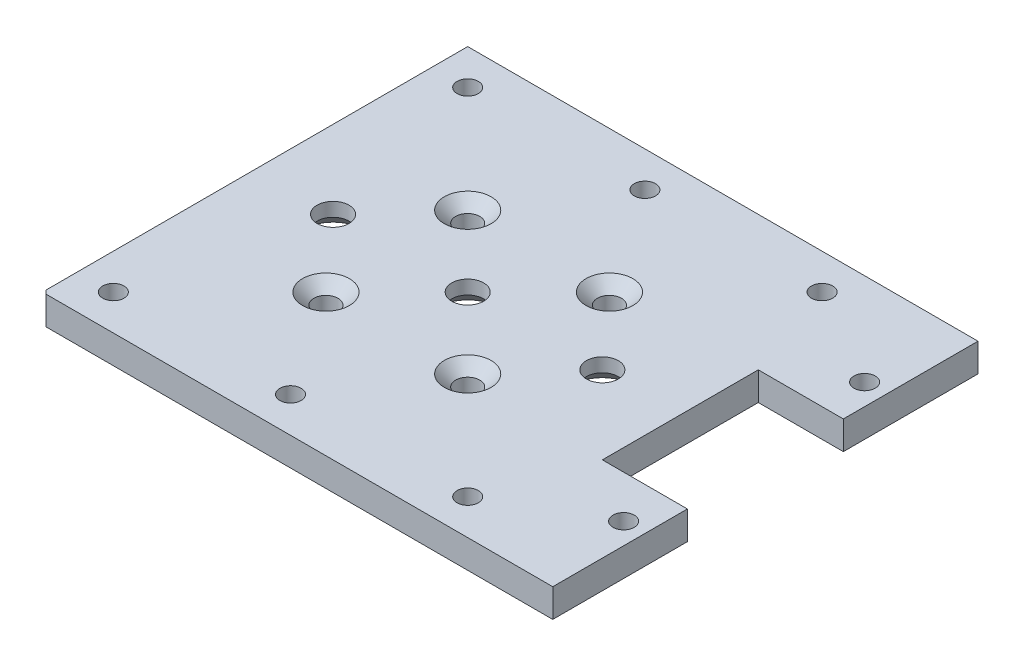
ISO-10303-21;
HEADER;
FILE_DESCRIPTION(('STEP AP214'),'2;1');
FILE_NAME('part.step','',(''),(''),'','','');
FILE_SCHEMA(('AUTOMOTIVE_DESIGN { 1 0 10303 214 1 1 1 1 }'));
ENDSEC;
DATA;
#1=APPLICATION_CONTEXT('core data for automotive mechanical design processes');
#2=APPLICATION_PROTOCOL_DEFINITION('international standard','automotive_design',2000,#1);
#3=PRODUCT_CONTEXT('',#1,'mechanical');
#4=PRODUCT('Part','Part','',(#3));
#5=PRODUCT_RELATED_PRODUCT_CATEGORY('part','',(#4));
#6=PRODUCT_DEFINITION_FORMATION('','',#4);
#7=PRODUCT_DEFINITION_CONTEXT('part definition',#1,'design');
#8=PRODUCT_DEFINITION('design','',#6,#7);
#9=PRODUCT_DEFINITION_SHAPE('','',#8);
#10=(LENGTH_UNIT() NAMED_UNIT(*) SI_UNIT(.MILLI.,.METRE.));
#11=(NAMED_UNIT(*) PLANE_ANGLE_UNIT() SI_UNIT($,.RADIAN.));
#12=(NAMED_UNIT(*) SI_UNIT($,.STERADIAN.) SOLID_ANGLE_UNIT());
#13=UNCERTAINTY_MEASURE_WITH_UNIT(LENGTH_MEASURE(1.E-05),#10,'distance_accuracy_value','');
#14=(GEOMETRIC_REPRESENTATION_CONTEXT(3) GLOBAL_UNCERTAINTY_ASSIGNED_CONTEXT((#13)) GLOBAL_UNIT_ASSIGNED_CONTEXT((#10,
#11,#12)) REPRESENTATION_CONTEXT('',''));
#15=CARTESIAN_POINT('',(0.,0.,0.));
#16=DIRECTION('',(0.,0.,1.));
#17=DIRECTION('',(1.,0.,0.));
#18=AXIS2_PLACEMENT_3D('',#15,#16,#17);
#19=CARTESIAN_POINT('',(30.,4.,30.));
#20=DIRECTION('',(-1.,0.,0.));
#21=DIRECTION('',(0.,0.,1.));
#22=AXIS2_PLACEMENT_3D('',#19,#20,#21);
#23=PLANE('',#22);
#24=DIRECTION('',(0.,1.,0.));
#25=VECTOR('',#24,1.);
#26=CARTESIAN_POINT('',(30.,-22.4722050542442,-11.));
#27=LINE('',#26,#25);
#28=CARTESIAN_POINT('',(30.,0.,-11.));
#29=VERTEX_POINT('',#28);
#30=CARTESIAN_POINT('',(30.,4.,-11.));
#31=VERTEX_POINT('',#30);
#32=EDGE_CURVE('E57',#29,#31,#27,.T.);
#33=ORIENTED_EDGE('',*,*,#32,.T.);
#34=DIRECTION('',(0.,0.,-1.));
#35=VECTOR('',#34,1.);
#36=CARTESIAN_POINT('',(30.,4.,30.));
#37=LINE('',#36,#35);
#38=CARTESIAN_POINT('',(30.,4.,11.));
#39=VERTEX_POINT('',#38);
#40=EDGE_CURVE('E133',#39,#31,#37,.T.);
#41=ORIENTED_EDGE('',*,*,#40,.F.);
#42=DIRECTION('',(0.,1.,0.));
#43=VECTOR('',#42,1.);
#44=CARTESIAN_POINT('',(30.,-22.4722050542442,11.));
#45=LINE('',#44,#43);
#46=CARTESIAN_POINT('',(30.,0.,11.));
#47=VERTEX_POINT('',#46);
#48=EDGE_CURVE('E162',#47,#39,#45,.T.);
#49=ORIENTED_EDGE('',*,*,#48,.F.);
#50=DIRECTION('',(0.,0.,-1.));
#51=VECTOR('',#50,1.);
#52=CARTESIAN_POINT('',(30.,0.,30.));
#53=LINE('',#52,#51);
#54=EDGE_CURVE('E62',#47,#29,#53,.T.);
#55=ORIENTED_EDGE('',*,*,#54,.T.);
#56=EDGE_LOOP('',(#33,#41,#49,#55));
#57=FACE_BOUND('',#56,.T.);
#58=ADVANCED_FACE('F41',(#57),#23,.F.);
#59=CARTESIAN_POINT('',(-30.,4.,-30.));
#60=DIRECTION('',(0.,0.,1.));
#61=DIRECTION('',(1.,0.,0.));
#62=AXIS2_PLACEMENT_3D('',#59,#60,#61);
#63=PLANE('',#62);
#64=DIRECTION('',(-1.,0.,0.));
#65=VECTOR('',#64,1.);
#66=CARTESIAN_POINT('',(-30.,0.,-30.));
#67=LINE('',#66,#65);
#68=CARTESIAN_POINT('',(42.,0.,-30.));
#69=VERTEX_POINT('',#68);
#70=CARTESIAN_POINT('',(-30.,0.,-30.));
#71=VERTEX_POINT('',#70);
#72=EDGE_CURVE('E280',#69,#71,#67,.T.);
#73=ORIENTED_EDGE('',*,*,#72,.T.);
#74=DIRECTION('',(0.,-1.,0.));
#75=VECTOR('',#74,1.);
#76=CARTESIAN_POINT('',(-30.,4.,-30.));
#77=LINE('',#76,#75);
#78=CARTESIAN_POINT('',(-30.,4.,-30.));
#79=VERTEX_POINT('',#78);
#80=EDGE_CURVE('E278',#79,#71,#77,.T.);
#81=ORIENTED_EDGE('',*,*,#80,.F.);
#82=DIRECTION('',(-1.,0.,0.));
#83=VECTOR('',#82,1.);
#84=CARTESIAN_POINT('',(-30.,4.,-30.));
#85=LINE('',#84,#83);
#86=CARTESIAN_POINT('',(42.,4.,-30.));
#87=VERTEX_POINT('',#86);
#88=EDGE_CURVE('E271',#87,#79,#85,.T.);
#89=ORIENTED_EDGE('',*,*,#88,.F.);
#90=DIRECTION('',(0.,1.,0.));
#91=VECTOR('',#90,1.);
#92=CARTESIAN_POINT('',(42.,-22.4722050542442,-30.));
#93=LINE('',#92,#91);
#94=EDGE_CURVE('E120',#69,#87,#93,.T.);
#95=ORIENTED_EDGE('',*,*,#94,.F.);
#96=EDGE_LOOP('',(#73,#81,#89,#95));
#97=FACE_BOUND('',#96,.T.);
#98=ADVANCED_FACE('F319',(#97),#63,.F.);
#99=CARTESIAN_POINT('',(-30.,4.,30.));
#100=DIRECTION('',(1.,0.,0.));
#101=DIRECTION('',(0.,0.,-1.));
#102=AXIS2_PLACEMENT_3D('',#99,#100,#101);
#103=PLANE('',#102);
#104=DIRECTION('',(0.,0.,1.));
#105=VECTOR('',#104,1.);
#106=CARTESIAN_POINT('',(-30.,0.,30.));
#107=LINE('',#106,#105);
#108=CARTESIAN_POINT('',(-30.,0.,29.5));
#109=VERTEX_POINT('',#108);
#110=EDGE_CURVE('E282',#71,#109,#107,.T.);
#111=ORIENTED_EDGE('',*,*,#110,.T.);
#112=DIRECTION('',(0.,1.,0.));
#113=VECTOR('',#112,1.);
#114=CARTESIAN_POINT('',(-30.,4.,29.5));
#115=LINE('',#114,#113);
#116=CARTESIAN_POINT('',(-30.,4.,29.5));
#117=VERTEX_POINT('',#116);
#118=EDGE_CURVE('E50',#109,#117,#115,.T.);
#119=ORIENTED_EDGE('',*,*,#118,.T.);
#120=DIRECTION('',(0.,0.,1.));
#121=VECTOR('',#120,1.);
#122=CARTESIAN_POINT('',(-30.,4.,30.));
#123=LINE('',#122,#121);
#124=EDGE_CURVE('E274',#79,#117,#123,.T.);
#125=ORIENTED_EDGE('',*,*,#124,.F.);
#126=ORIENTED_EDGE('',*,*,#80,.T.);
#127=EDGE_LOOP('',(#111,#119,#125,#126));
#128=FACE_BOUND('',#127,.T.);
#129=ADVANCED_FACE('F295',(#128),#103,.F.);
#130=CARTESIAN_POINT('',(-30.,4.,30.));
#131=DIRECTION('',(0.,0.,-1.));
#132=DIRECTION('',(-1.,0.,0.));
#133=AXIS2_PLACEMENT_3D('',#130,#131,#132);
#134=PLANE('',#133);
#135=DIRECTION('',(1.,0.,0.));
#136=VECTOR('',#135,1.);
#137=CARTESIAN_POINT('',(-30.,4.,30.));
#138=LINE('',#137,#136);
#139=CARTESIAN_POINT('',(-29.5,4.,30.));
#140=VERTEX_POINT('',#139);
#141=CARTESIAN_POINT('',(42.,4.,30.));
#142=VERTEX_POINT('',#141);
#143=EDGE_CURVE('E276',#140,#142,#138,.T.);
#144=ORIENTED_EDGE('',*,*,#143,.F.);
#145=DIRECTION('',(0.,-1.,0.));
#146=VECTOR('',#145,1.);
#147=CARTESIAN_POINT('',(-29.5,4.,30.));
#148=LINE('',#147,#146);
#149=CARTESIAN_POINT('',(-29.5,0.,30.));
#150=VERTEX_POINT('',#149);
#151=EDGE_CURVE('E288',#140,#150,#148,.T.);
#152=ORIENTED_EDGE('',*,*,#151,.T.);
#153=DIRECTION('',(1.,0.,0.));
#154=VECTOR('',#153,1.);
#155=CARTESIAN_POINT('',(-30.,0.,30.));
#156=LINE('',#155,#154);
#157=CARTESIAN_POINT('',(42.,0.,30.));
#158=VERTEX_POINT('',#157);
#159=EDGE_CURVE('E272',#150,#158,#156,.T.);
#160=ORIENTED_EDGE('',*,*,#159,.T.);
#161=DIRECTION('',(0.,1.,0.));
#162=VECTOR('',#161,1.);
#163=CARTESIAN_POINT('',(42.,-22.4722050542442,30.));
#164=LINE('',#163,#162);
#165=EDGE_CURVE('E156',#158,#142,#164,.T.);
#166=ORIENTED_EDGE('',*,*,#165,.T.);
#167=EDGE_LOOP('',(#144,#152,#160,#166));
#168=FACE_BOUND('',#167,.T.);
#169=ADVANCED_FACE('F304',(#168),#134,.F.);
#170=CARTESIAN_POINT('',(0.,4.,0.));
#171=DIRECTION('',(0.,-1.,0.));
#172=DIRECTION('',(0.,0.,-1.));
#173=AXIS2_PLACEMENT_3D('',#170,#171,#172);
#174=PLANE('',#173);
#175=CARTESIAN_POINT('',(25.,4.,-25.));
#176=DIRECTION('',(0.,1.,0.));
#177=DIRECTION('',(0.,0.,1.));
#178=AXIS2_PLACEMENT_3D('',#175,#176,#177);
#179=CIRCLE('',#178,1.50000000000001);
#180=CARTESIAN_POINT('',(25.,4.,-23.5));
#181=VERTEX_POINT('',#180);
#182=EDGE_CURVE('E159',#181,#181,#179,.T.);
#183=ORIENTED_EDGE('',*,*,#182,.F.);
#184=EDGE_LOOP('',(#183));
#185=FACE_BOUND('',#184,.T.);
#186=CARTESIAN_POINT('',(25.,4.,25.));
#187=DIRECTION('',(0.,1.,0.));
#188=DIRECTION('',(0.,0.,1.));
#189=AXIS2_PLACEMENT_3D('',#186,#187,#188);
#190=CIRCLE('',#189,1.50000000000001);
#191=CARTESIAN_POINT('',(25.,4.,26.5));
#192=VERTEX_POINT('',#191);
#193=EDGE_CURVE('E177',#192,#192,#190,.T.);
#194=ORIENTED_EDGE('',*,*,#193,.F.);
#195=EDGE_LOOP('',(#194));
#196=FACE_BOUND('',#195,.T.);
#197=CARTESIAN_POINT('',(0.,4.,25.));
#198=DIRECTION('',(0.,1.,0.));
#199=DIRECTION('',(0.,0.,1.));
#200=AXIS2_PLACEMENT_3D('',#197,#198,#199);
#201=CIRCLE('',#200,1.50000000000001);
#202=CARTESIAN_POINT('',(0.,4.,26.5));
#203=VERTEX_POINT('',#202);
#204=EDGE_CURVE('E183',#203,#203,#201,.T.);
#205=ORIENTED_EDGE('',*,*,#204,.F.);
#206=EDGE_LOOP('',(#205));
#207=FACE_BOUND('',#206,.T.);
#208=CARTESIAN_POINT('',(-25.,4.,25.));
#209=DIRECTION('',(0.,1.,0.));
#210=DIRECTION('',(0.,0.,1.));
#211=AXIS2_PLACEMENT_3D('',#208,#209,#210);
#212=CIRCLE('',#211,1.50000000000001);
#213=CARTESIAN_POINT('',(-25.,4.,26.5));
#214=VERTEX_POINT('',#213);
#215=EDGE_CURVE('E189',#214,#214,#212,.T.);
#216=ORIENTED_EDGE('',*,*,#215,.F.);
#217=EDGE_LOOP('',(#216));
#218=FACE_BOUND('',#217,.T.);
#219=CARTESIAN_POINT('',(-25.,4.,-25.));
#220=DIRECTION('',(0.,1.,0.));
#221=DIRECTION('',(0.,0.,1.));
#222=AXIS2_PLACEMENT_3D('',#219,#220,#221);
#223=CIRCLE('',#222,1.50000000000001);
#224=CARTESIAN_POINT('',(-25.,4.,-23.5));
#225=VERTEX_POINT('',#224);
#226=EDGE_CURVE('E195',#225,#225,#223,.T.);
#227=ORIENTED_EDGE('',*,*,#226,.F.);
#228=EDGE_LOOP('',(#227));
#229=FACE_BOUND('',#228,.T.);
#230=CARTESIAN_POINT('',(0.,4.,-25.));
#231=DIRECTION('',(0.,1.,0.));
#232=DIRECTION('',(0.,0.,1.));
#233=AXIS2_PLACEMENT_3D('',#230,#231,#232);
#234=CIRCLE('',#233,1.50000000000001);
#235=CARTESIAN_POINT('',(0.,4.,-23.5));
#236=VERTEX_POINT('',#235);
#237=EDGE_CURVE('E201',#236,#236,#234,.T.);
#238=ORIENTED_EDGE('',*,*,#237,.F.);
#239=EDGE_LOOP('',(#238));
#240=FACE_BOUND('',#239,.T.);
#241=CARTESIAN_POINT('',(-19.,4.,0.));
#242=DIRECTION('',(0.,-1.,0.));
#243=DIRECTION('',(0.,0.,-1.));
#244=AXIS2_PLACEMENT_3D('',#241,#242,#243);
#245=CIRCLE('',#244,2.25);
#246=CARTESIAN_POINT('',(-19.,4.,-2.25));
#247=VERTEX_POINT('',#246);
#248=EDGE_CURVE('E213',#247,#247,#245,.T.);
#249=ORIENTED_EDGE('',*,*,#248,.T.);
#250=EDGE_LOOP('',(#249));
#251=FACE_BOUND('',#250,.T.);
#252=CARTESIAN_POINT('',(0.,4.,0.));
#253=DIRECTION('',(0.,-1.,0.));
#254=DIRECTION('',(0.,0.,-1.));
#255=AXIS2_PLACEMENT_3D('',#252,#253,#254);
#256=CIRCLE('',#255,2.25);
#257=CARTESIAN_POINT('',(0.,4.,-2.25));
#258=VERTEX_POINT('',#257);
#259=EDGE_CURVE('E222',#258,#258,#256,.T.);
#260=ORIENTED_EDGE('',*,*,#259,.T.);
#261=EDGE_LOOP('',(#260));
#262=FACE_BOUND('',#261,.T.);
#263=CARTESIAN_POINT('',(19.,4.,0.));
#264=DIRECTION('',(0.,-1.,0.));
#265=DIRECTION('',(0.,0.,-1.));
#266=AXIS2_PLACEMENT_3D('',#263,#264,#265);
#267=CIRCLE('',#266,2.25);
#268=CARTESIAN_POINT('',(19.,4.,-2.25));
#269=VERTEX_POINT('',#268);
#270=EDGE_CURVE('E231',#269,#269,#267,.T.);
#271=ORIENTED_EDGE('',*,*,#270,.T.);
#272=EDGE_LOOP('',(#271));
#273=FACE_BOUND('',#272,.T.);
#274=CARTESIAN_POINT('',(-10.,4.,-10.));
#275=DIRECTION('',(0.,1.,0.));
#276=DIRECTION('',(0.,0.,1.));
#277=AXIS2_PLACEMENT_3D('',#274,#275,#276);
#278=CIRCLE('',#277,3.3);
#279=CARTESIAN_POINT('',(-10.,4.,-6.7));
#280=VERTEX_POINT('',#279);
#281=EDGE_CURVE('E234',#280,#280,#278,.T.);
#282=ORIENTED_EDGE('',*,*,#281,.F.);
#283=EDGE_LOOP('',(#282));
#284=FACE_BOUND('',#283,.T.);
#285=CARTESIAN_POINT('',(10.,4.,-10.0000000000006));
#286=DIRECTION('',(0.,1.,0.));
#287=DIRECTION('',(0.,0.,1.));
#288=AXIS2_PLACEMENT_3D('',#285,#286,#287);
#289=CIRCLE('',#288,3.3);
#290=CARTESIAN_POINT('',(10.,4.,-6.70000000000057));
#291=VERTEX_POINT('',#290);
#292=EDGE_CURVE('E243',#291,#291,#289,.T.);
#293=ORIENTED_EDGE('',*,*,#292,.F.);
#294=EDGE_LOOP('',(#293));
#295=FACE_BOUND('',#294,.T.);
#296=CARTESIAN_POINT('',(10.0000000000006,4.,9.99999999999944));
#297=DIRECTION('',(0.,1.,0.));
#298=DIRECTION('',(0.,0.,1.));
#299=AXIS2_PLACEMENT_3D('',#296,#297,#298);
#300=CIRCLE('',#299,3.3);
#301=CARTESIAN_POINT('',(10.0000000000006,4.,13.2999999999994));
#302=VERTEX_POINT('',#301);
#303=EDGE_CURVE('E252',#302,#302,#300,.T.);
#304=ORIENTED_EDGE('',*,*,#303,.F.);
#305=EDGE_LOOP('',(#304));
#306=FACE_BOUND('',#305,.T.);
#307=CARTESIAN_POINT('',(-9.99999999999944,4.,10.));
#308=DIRECTION('',(0.,1.,0.));
#309=DIRECTION('',(0.,0.,1.));
#310=AXIS2_PLACEMENT_3D('',#307,#308,#309);
#311=CIRCLE('',#310,3.3);
#312=CARTESIAN_POINT('',(-9.99999999999944,4.,13.3));
#313=VERTEX_POINT('',#312);
#314=EDGE_CURVE('E261',#313,#313,#311,.T.);
#315=ORIENTED_EDGE('',*,*,#314,.F.);
#316=EDGE_LOOP('',(#315));
#317=FACE_BOUND('',#316,.T.);
#318=ORIENTED_EDGE('',*,*,#124,.T.);
#319=DIRECTION('',(-0.707106781186548,0.,-0.707106781186548));
#320=VECTOR('',#319,1.);
#321=CARTESIAN_POINT('',(-29.5,4.,30.));
#322=LINE('',#321,#320);
#323=EDGE_CURVE('E11',#117,#140,#322,.F.);
#324=ORIENTED_EDGE('',*,*,#323,.T.);
#325=ORIENTED_EDGE('',*,*,#143,.T.);
#326=DIRECTION('',(0.,0.,-1.));
#327=VECTOR('',#326,1.);
#328=CARTESIAN_POINT('',(42.,4.,30.));
#329=LINE('',#328,#327);
#330=CARTESIAN_POINT('',(42.,4.,11.));
#331=VERTEX_POINT('',#330);
#332=EDGE_CURVE('E150',#142,#331,#329,.T.);
#333=ORIENTED_EDGE('',*,*,#332,.T.);
#334=DIRECTION('',(-1.,0.,0.));
#335=VECTOR('',#334,1.);
#336=CARTESIAN_POINT('',(30.,4.,11.));
#337=LINE('',#336,#335);
#338=EDGE_CURVE('E147',#331,#39,#337,.T.);
#339=ORIENTED_EDGE('',*,*,#338,.T.);
#340=ORIENTED_EDGE('',*,*,#40,.T.);
#341=DIRECTION('',(-1.,0.,0.));
#342=VECTOR('',#341,1.);
#343=CARTESIAN_POINT('',(30.,4.,-11.));
#344=LINE('',#343,#342);
#345=CARTESIAN_POINT('',(42.,4.,-11.));
#346=VERTEX_POINT('',#345);
#347=EDGE_CURVE('E114',#346,#31,#344,.T.);
#348=ORIENTED_EDGE('',*,*,#347,.F.);
#349=DIRECTION('',(0.,0.,1.));
#350=VECTOR('',#349,1.);
#351=CARTESIAN_POINT('',(42.,4.,-30.));
#352=LINE('',#351,#350);
#353=EDGE_CURVE('E124',#87,#346,#352,.T.);
#354=ORIENTED_EDGE('',*,*,#353,.F.);
#355=ORIENTED_EDGE('',*,*,#88,.T.);
#356=EDGE_LOOP('',(#318,#324,#325,#333,#339,#340,#348,#354,#355));
#357=FACE_BOUND('',#356,.T.);
#358=CARTESIAN_POINT('',(39.,4.,17.));
#359=DIRECTION('',(0.,1.,0.));
#360=DIRECTION('',(0.,0.,1.));
#361=AXIS2_PLACEMENT_3D('',#358,#359,#360);
#362=CIRCLE('',#361,1.5);
#363=CARTESIAN_POINT('',(39.,4.,18.5));
#364=VERTEX_POINT('',#363);
#365=EDGE_CURVE('E153',#364,#364,#362,.T.);
#366=ORIENTED_EDGE('',*,*,#365,.F.);
#367=EDGE_LOOP('',(#366));
#368=FACE_BOUND('',#367,.T.);
#369=CARTESIAN_POINT('',(39.,4.,-17.));
#370=DIRECTION('',(0.,-1.,0.));
#371=DIRECTION('',(0.,0.,-1.));
#372=AXIS2_PLACEMENT_3D('',#369,#370,#371);
#373=CIRCLE('',#372,1.5);
#374=CARTESIAN_POINT('',(39.,4.,-18.5));
#375=VERTEX_POINT('',#374);
#376=EDGE_CURVE('E134',#375,#375,#373,.T.);
#377=ORIENTED_EDGE('',*,*,#376,.T.);
#378=EDGE_LOOP('',(#377));
#379=FACE_BOUND('',#378,.T.);
#380=ADVANCED_FACE('F130',(#185,#196,#207,#218,#229,#240,#251,#262,#273,#284,#295,#306,#317,
#357,#368,#379),#174,.F.);
#381=CARTESIAN_POINT('',(0.,0.,0.));
#382=DIRECTION('',(0.,-1.,0.));
#383=DIRECTION('',(0.,0.,-1.));
#384=AXIS2_PLACEMENT_3D('',#381,#382,#383);
#385=PLANE('',#384);
#386=CARTESIAN_POINT('',(25.,0.,-25.));
#387=DIRECTION('',(0.,1.,0.));
#388=DIRECTION('',(0.,0.,1.));
#389=AXIS2_PLACEMENT_3D('',#386,#387,#388);
#390=CIRCLE('',#389,1.50000000000001);
#391=CARTESIAN_POINT('',(25.,0.,-23.5));
#392=VERTEX_POINT('',#391);
#393=EDGE_CURVE('E174',#392,#392,#390,.T.);
#394=ORIENTED_EDGE('',*,*,#393,.T.);
#395=EDGE_LOOP('',(#394));
#396=FACE_BOUND('',#395,.T.);
#397=CARTESIAN_POINT('',(25.,0.,25.));
#398=DIRECTION('',(0.,1.,0.));
#399=DIRECTION('',(0.,0.,1.));
#400=AXIS2_PLACEMENT_3D('',#397,#398,#399);
#401=CIRCLE('',#400,1.50000000000001);
#402=CARTESIAN_POINT('',(25.,0.,26.5));
#403=VERTEX_POINT('',#402);
#404=EDGE_CURVE('E180',#403,#403,#401,.T.);
#405=ORIENTED_EDGE('',*,*,#404,.T.);
#406=EDGE_LOOP('',(#405));
#407=FACE_BOUND('',#406,.T.);
#408=CARTESIAN_POINT('',(0.,0.,25.));
#409=DIRECTION('',(0.,1.,0.));
#410=DIRECTION('',(0.,0.,1.));
#411=AXIS2_PLACEMENT_3D('',#408,#409,#410);
#412=CIRCLE('',#411,1.50000000000001);
#413=CARTESIAN_POINT('',(0.,0.,26.5));
#414=VERTEX_POINT('',#413);
#415=EDGE_CURVE('E186',#414,#414,#412,.T.);
#416=ORIENTED_EDGE('',*,*,#415,.T.);
#417=EDGE_LOOP('',(#416));
#418=FACE_BOUND('',#417,.T.);
#419=CARTESIAN_POINT('',(-25.,0.,25.));
#420=DIRECTION('',(0.,1.,0.));
#421=DIRECTION('',(0.,0.,1.));
#422=AXIS2_PLACEMENT_3D('',#419,#420,#421);
#423=CIRCLE('',#422,1.50000000000001);
#424=CARTESIAN_POINT('',(-25.,0.,26.5));
#425=VERTEX_POINT('',#424);
#426=EDGE_CURVE('E192',#425,#425,#423,.T.);
#427=ORIENTED_EDGE('',*,*,#426,.T.);
#428=EDGE_LOOP('',(#427));
#429=FACE_BOUND('',#428,.T.);
#430=CARTESIAN_POINT('',(-25.,0.,-25.));
#431=DIRECTION('',(0.,1.,0.));
#432=DIRECTION('',(0.,0.,1.));
#433=AXIS2_PLACEMENT_3D('',#430,#431,#432);
#434=CIRCLE('',#433,1.50000000000001);
#435=CARTESIAN_POINT('',(-25.,0.,-23.5));
#436=VERTEX_POINT('',#435);
#437=EDGE_CURVE('E198',#436,#436,#434,.T.);
#438=ORIENTED_EDGE('',*,*,#437,.T.);
#439=EDGE_LOOP('',(#438));
#440=FACE_BOUND('',#439,.T.);
#441=CARTESIAN_POINT('',(0.,0.,-25.));
#442=DIRECTION('',(0.,1.,0.));
#443=DIRECTION('',(0.,0.,1.));
#444=AXIS2_PLACEMENT_3D('',#441,#442,#443);
#445=CIRCLE('',#444,1.50000000000001);
#446=CARTESIAN_POINT('',(0.,0.,-23.5));
#447=VERTEX_POINT('',#446);
#448=EDGE_CURVE('E204',#447,#447,#445,.T.);
#449=ORIENTED_EDGE('',*,*,#448,.T.);
#450=EDGE_LOOP('',(#449));
#451=FACE_BOUND('',#450,.T.);
#452=CARTESIAN_POINT('',(-19.,0.,0.));
#453=DIRECTION('',(0.,-1.,0.));
#454=DIRECTION('',(0.,0.,-1.));
#455=AXIS2_PLACEMENT_3D('',#452,#453,#454);
#456=CIRCLE('',#455,4.3);
#457=CARTESIAN_POINT('',(-19.,0.,-4.3));
#458=VERTEX_POINT('',#457);
#459=EDGE_CURVE('E207',#458,#458,#456,.T.);
#460=ORIENTED_EDGE('',*,*,#459,.F.);
#461=EDGE_LOOP('',(#460));
#462=FACE_BOUND('',#461,.T.);
#463=CARTESIAN_POINT('',(0.,0.,0.));
#464=DIRECTION('',(0.,-1.,0.));
#465=DIRECTION('',(0.,0.,-1.));
#466=AXIS2_PLACEMENT_3D('',#463,#464,#465);
#467=CIRCLE('',#466,4.3);
#468=CARTESIAN_POINT('',(0.,0.,-4.3));
#469=VERTEX_POINT('',#468);
#470=EDGE_CURVE('E216',#469,#469,#467,.T.);
#471=ORIENTED_EDGE('',*,*,#470,.F.);
#472=EDGE_LOOP('',(#471));
#473=FACE_BOUND('',#472,.T.);
#474=CARTESIAN_POINT('',(19.,0.,0.));
#475=DIRECTION('',(0.,-1.,0.));
#476=DIRECTION('',(0.,0.,-1.));
#477=AXIS2_PLACEMENT_3D('',#474,#475,#476);
#478=CIRCLE('',#477,4.3);
#479=CARTESIAN_POINT('',(19.,0.,-4.3));
#480=VERTEX_POINT('',#479);
#481=EDGE_CURVE('E225',#480,#480,#478,.T.);
#482=ORIENTED_EDGE('',*,*,#481,.F.);
#483=EDGE_LOOP('',(#482));
#484=FACE_BOUND('',#483,.T.);
#485=CARTESIAN_POINT('',(-10.,0.,-10.));
#486=DIRECTION('',(0.,1.,0.));
#487=DIRECTION('',(0.,0.,1.));
#488=AXIS2_PLACEMENT_3D('',#485,#486,#487);
#489=CIRCLE('',#488,1.7);
#490=CARTESIAN_POINT('',(-10.,0.,-8.3));
#491=VERTEX_POINT('',#490);
#492=EDGE_CURVE('E240',#491,#491,#489,.T.);
#493=ORIENTED_EDGE('',*,*,#492,.T.);
#494=EDGE_LOOP('',(#493));
#495=FACE_BOUND('',#494,.T.);
#496=CARTESIAN_POINT('',(10.,0.,-10.0000000000006));
#497=DIRECTION('',(0.,1.,0.));
#498=DIRECTION('',(0.,0.,1.));
#499=AXIS2_PLACEMENT_3D('',#496,#497,#498);
#500=CIRCLE('',#499,1.7);
#501=CARTESIAN_POINT('',(10.,0.,-8.30000000000057));
#502=VERTEX_POINT('',#501);
#503=EDGE_CURVE('E249',#502,#502,#500,.T.);
#504=ORIENTED_EDGE('',*,*,#503,.T.);
#505=EDGE_LOOP('',(#504));
#506=FACE_BOUND('',#505,.T.);
#507=CARTESIAN_POINT('',(10.0000000000006,0.,9.99999999999944));
#508=DIRECTION('',(0.,1.,0.));
#509=DIRECTION('',(0.,0.,1.));
#510=AXIS2_PLACEMENT_3D('',#507,#508,#509);
#511=CIRCLE('',#510,1.7);
#512=CARTESIAN_POINT('',(10.0000000000006,0.,11.6999999999994));
#513=VERTEX_POINT('',#512);
#514=EDGE_CURVE('E258',#513,#513,#511,.T.);
#515=ORIENTED_EDGE('',*,*,#514,.T.);
#516=EDGE_LOOP('',(#515));
#517=FACE_BOUND('',#516,.T.);
#518=CARTESIAN_POINT('',(-9.99999999999944,0.,10.));
#519=DIRECTION('',(0.,1.,0.));
#520=DIRECTION('',(0.,0.,1.));
#521=AXIS2_PLACEMENT_3D('',#518,#519,#520);
#522=CIRCLE('',#521,1.7);
#523=CARTESIAN_POINT('',(-9.99999999999944,0.,11.7));
#524=VERTEX_POINT('',#523);
#525=EDGE_CURVE('E267',#524,#524,#522,.T.);
#526=ORIENTED_EDGE('',*,*,#525,.T.);
#527=EDGE_LOOP('',(#526));
#528=FACE_BOUND('',#527,.T.);
#529=ORIENTED_EDGE('',*,*,#159,.F.);
#530=DIRECTION('',(0.707106781186548,0.,0.707106781186548));
#531=VECTOR('',#530,1.);
#532=CARTESIAN_POINT('',(-29.75,0.,29.75));
#533=LINE('',#532,#531);
#534=EDGE_CURVE('E291',#150,#109,#533,.F.);
#535=ORIENTED_EDGE('',*,*,#534,.T.);
#536=ORIENTED_EDGE('',*,*,#110,.F.);
#537=ORIENTED_EDGE('',*,*,#72,.F.);
#538=DIRECTION('',(0.,0.,1.));
#539=VECTOR('',#538,1.);
#540=CARTESIAN_POINT('',(42.,0.,-30.));
#541=LINE('',#540,#539);
#542=CARTESIAN_POINT('',(42.,0.,-11.));
#543=VERTEX_POINT('',#542);
#544=EDGE_CURVE('E137',#69,#543,#541,.T.);
#545=ORIENTED_EDGE('',*,*,#544,.T.);
#546=DIRECTION('',(-1.,0.,0.));
#547=VECTOR('',#546,1.);
#548=CARTESIAN_POINT('',(30.,0.,-11.));
#549=LINE('',#548,#547);
#550=EDGE_CURVE('E116',#543,#29,#549,.T.);
#551=ORIENTED_EDGE('',*,*,#550,.T.);
#552=ORIENTED_EDGE('',*,*,#54,.F.);
#553=DIRECTION('',(-1.,0.,0.));
#554=VECTOR('',#553,1.);
#555=CARTESIAN_POINT('',(30.,0.,11.));
#556=LINE('',#555,#554);
#557=CARTESIAN_POINT('',(42.,0.,11.));
#558=VERTEX_POINT('',#557);
#559=EDGE_CURVE('E141',#558,#47,#556,.T.);
#560=ORIENTED_EDGE('',*,*,#559,.F.);
#561=DIRECTION('',(0.,0.,-1.));
#562=VECTOR('',#561,1.);
#563=CARTESIAN_POINT('',(42.,0.,30.));
#564=LINE('',#563,#562);
#565=EDGE_CURVE('E163',#158,#558,#564,.T.);
#566=ORIENTED_EDGE('',*,*,#565,.F.);
#567=EDGE_LOOP('',(#529,#535,#536,#537,#545,#551,#552,#560,#566));
#568=FACE_BOUND('',#567,.T.);
#569=CARTESIAN_POINT('',(39.,0.,17.));
#570=DIRECTION('',(0.,-1.,0.));
#571=DIRECTION('',(0.,0.,-1.));
#572=AXIS2_PLACEMENT_3D('',#569,#570,#571);
#573=CIRCLE('',#572,1.5);
#574=CARTESIAN_POINT('',(39.,0.,15.5));
#575=VERTEX_POINT('',#574);
#576=EDGE_CURVE('E149',#575,#575,#573,.F.);
#577=ORIENTED_EDGE('',*,*,#576,.T.);
#578=EDGE_LOOP('',(#577));
#579=FACE_BOUND('',#578,.T.);
#580=CARTESIAN_POINT('',(39.,0.,-17.));
#581=DIRECTION('',(0.,-1.,0.));
#582=DIRECTION('',(0.,0.,-1.));
#583=AXIS2_PLACEMENT_3D('',#580,#581,#582);
#584=CIRCLE('',#583,1.5);
#585=CARTESIAN_POINT('',(39.,0.,-18.5));
#586=VERTEX_POINT('',#585);
#587=EDGE_CURVE('E144',#586,#586,#584,.T.);
#588=ORIENTED_EDGE('',*,*,#587,.F.);
#589=EDGE_LOOP('',(#588));
#590=FACE_BOUND('',#589,.T.);
#591=ADVANCED_FACE('F307',(#396,#407,#418,#429,#440,#451,#462,#473,#484,#495,#506,#517,#528,
#568,#579,#590),#385,.T.);
#592=CARTESIAN_POINT('',(-9.99999999999944,4.,10.));
#593=DIRECTION('',(0.,1.,0.));
#594=DIRECTION('',(0.,0.,1.));
#595=AXIS2_PLACEMENT_3D('',#592,#593,#594);
#596=CYLINDRICAL_SURFACE('',#595,1.7);
#597=ORIENTED_EDGE('',*,*,#525,.F.);
#598=EDGE_LOOP('',(#597));
#599=FACE_BOUND('',#598,.T.);
#600=CARTESIAN_POINT('',(-9.99999999999944,2.4,10.));
#601=DIRECTION('',(0.,1.,0.));
#602=DIRECTION('',(0.,0.,1.));
#603=AXIS2_PLACEMENT_3D('',#600,#601,#602);
#604=CIRCLE('',#603,1.7);
#605=CARTESIAN_POINT('',(-9.99999999999944,2.4,11.7));
#606=VERTEX_POINT('',#605);
#607=EDGE_CURVE('E264',#606,#606,#604,.T.);
#608=ORIENTED_EDGE('',*,*,#607,.T.);
#609=EDGE_LOOP('',(#608));
#610=FACE_BOUND('',#609,.T.);
#611=ADVANCED_FACE('F332',(#599,#610),#596,.F.);
#612=CARTESIAN_POINT('',(-9.99999999999944,4.,10.));
#613=DIRECTION('',(0.,1.,0.));
#614=DIRECTION('',(0.,0.,1.));
#615=AXIS2_PLACEMENT_3D('',#612,#613,#614);
#616=CONICAL_SURFACE('',#615,3.3,0.785398163397449);
#617=ORIENTED_EDGE('',*,*,#607,.F.);
#618=EDGE_LOOP('',(#617));
#619=FACE_BOUND('',#618,.T.);
#620=ORIENTED_EDGE('',*,*,#314,.T.);
#621=EDGE_LOOP('',(#620));
#622=FACE_BOUND('',#621,.T.);
#623=ADVANCED_FACE('F339',(#619,#622),#616,.F.);
#624=CARTESIAN_POINT('',(10.0000000000006,4.,9.99999999999944));
#625=DIRECTION('',(0.,1.,0.));
#626=DIRECTION('',(0.,0.,1.));
#627=AXIS2_PLACEMENT_3D('',#624,#625,#626);
#628=CYLINDRICAL_SURFACE('',#627,1.7);
#629=ORIENTED_EDGE('',*,*,#514,.F.);
#630=EDGE_LOOP('',(#629));
#631=FACE_BOUND('',#630,.T.);
#632=CARTESIAN_POINT('',(10.0000000000006,2.4,9.99999999999944));
#633=DIRECTION('',(0.,1.,0.));
#634=DIRECTION('',(0.,0.,1.));
#635=AXIS2_PLACEMENT_3D('',#632,#633,#634);
#636=CIRCLE('',#635,1.7);
#637=CARTESIAN_POINT('',(10.0000000000006,2.4,11.6999999999994));
#638=VERTEX_POINT('',#637);
#639=EDGE_CURVE('E255',#638,#638,#636,.T.);
#640=ORIENTED_EDGE('',*,*,#639,.T.);
#641=EDGE_LOOP('',(#640));
#642=FACE_BOUND('',#641,.T.);
#643=ADVANCED_FACE('F343',(#631,#642),#628,.F.);
#644=CARTESIAN_POINT('',(10.0000000000006,4.,9.99999999999944));
#645=DIRECTION('',(0.,1.,0.));
#646=DIRECTION('',(0.,0.,1.));
#647=AXIS2_PLACEMENT_3D('',#644,#645,#646);
#648=CONICAL_SURFACE('',#647,3.3,0.785398163397449);
#649=ORIENTED_EDGE('',*,*,#639,.F.);
#650=EDGE_LOOP('',(#649));
#651=FACE_BOUND('',#650,.T.);
#652=ORIENTED_EDGE('',*,*,#303,.T.);
#653=EDGE_LOOP('',(#652));
#654=FACE_BOUND('',#653,.T.);
#655=ADVANCED_FACE('F347',(#651,#654),#648,.F.);
#656=CARTESIAN_POINT('',(10.,4.,-10.0000000000006));
#657=DIRECTION('',(0.,1.,0.));
#658=DIRECTION('',(0.,0.,1.));
#659=AXIS2_PLACEMENT_3D('',#656,#657,#658);
#660=CYLINDRICAL_SURFACE('',#659,1.7);
#661=ORIENTED_EDGE('',*,*,#503,.F.);
#662=EDGE_LOOP('',(#661));
#663=FACE_BOUND('',#662,.T.);
#664=CARTESIAN_POINT('',(10.,2.4,-10.0000000000006));
#665=DIRECTION('',(0.,1.,0.));
#666=DIRECTION('',(0.,0.,1.));
#667=AXIS2_PLACEMENT_3D('',#664,#665,#666);
#668=CIRCLE('',#667,1.7);
#669=CARTESIAN_POINT('',(10.,2.4,-8.30000000000057));
#670=VERTEX_POINT('',#669);
#671=EDGE_CURVE('E246',#670,#670,#668,.T.);
#672=ORIENTED_EDGE('',*,*,#671,.T.);
#673=EDGE_LOOP('',(#672));
#674=FACE_BOUND('',#673,.T.);
#675=ADVANCED_FACE('F351',(#663,#674),#660,.F.);
#676=CARTESIAN_POINT('',(10.,4.,-10.0000000000006));
#677=DIRECTION('',(0.,1.,0.));
#678=DIRECTION('',(0.,0.,1.));
#679=AXIS2_PLACEMENT_3D('',#676,#677,#678);
#680=CONICAL_SURFACE('',#679,3.3,0.785398163397449);
#681=ORIENTED_EDGE('',*,*,#671,.F.);
#682=EDGE_LOOP('',(#681));
#683=FACE_BOUND('',#682,.T.);
#684=ORIENTED_EDGE('',*,*,#292,.T.);
#685=EDGE_LOOP('',(#684));
#686=FACE_BOUND('',#685,.T.);
#687=ADVANCED_FACE('F355',(#683,#686),#680,.F.);
#688=CARTESIAN_POINT('',(-10.,4.,-10.));
#689=DIRECTION('',(0.,1.,0.));
#690=DIRECTION('',(0.,0.,1.));
#691=AXIS2_PLACEMENT_3D('',#688,#689,#690);
#692=CYLINDRICAL_SURFACE('',#691,1.7);
#693=ORIENTED_EDGE('',*,*,#492,.F.);
#694=EDGE_LOOP('',(#693));
#695=FACE_BOUND('',#694,.T.);
#696=CARTESIAN_POINT('',(-10.,2.4,-10.));
#697=DIRECTION('',(0.,1.,0.));
#698=DIRECTION('',(0.,0.,1.));
#699=AXIS2_PLACEMENT_3D('',#696,#697,#698);
#700=CIRCLE('',#699,1.7);
#701=CARTESIAN_POINT('',(-10.,2.4,-8.3));
#702=VERTEX_POINT('',#701);
#703=EDGE_CURVE('E237',#702,#702,#700,.T.);
#704=ORIENTED_EDGE('',*,*,#703,.T.);
#705=EDGE_LOOP('',(#704));
#706=FACE_BOUND('',#705,.T.);
#707=ADVANCED_FACE('F359',(#695,#706),#692,.F.);
#708=CARTESIAN_POINT('',(-10.,4.,-10.));
#709=DIRECTION('',(0.,1.,0.));
#710=DIRECTION('',(0.,0.,1.));
#711=AXIS2_PLACEMENT_3D('',#708,#709,#710);
#712=CONICAL_SURFACE('',#711,3.3,0.785398163397449);
#713=ORIENTED_EDGE('',*,*,#703,.F.);
#714=EDGE_LOOP('',(#713));
#715=FACE_BOUND('',#714,.T.);
#716=ORIENTED_EDGE('',*,*,#281,.T.);
#717=EDGE_LOOP('',(#716));
#718=FACE_BOUND('',#717,.T.);
#719=ADVANCED_FACE('F363',(#715,#718),#712,.F.);
#720=CARTESIAN_POINT('',(19.,0.,0.));
#721=DIRECTION('',(0.,-1.,0.));
#722=DIRECTION('',(0.,0.,-1.));
#723=AXIS2_PLACEMENT_3D('',#720,#721,#722);
#724=CYLINDRICAL_SURFACE('',#723,2.25);
#725=ORIENTED_EDGE('',*,*,#270,.F.);
#726=EDGE_LOOP('',(#725));
#727=FACE_BOUND('',#726,.T.);
#728=CARTESIAN_POINT('',(19.,2.05,0.));
#729=DIRECTION('',(0.,-1.,0.));
#730=DIRECTION('',(0.,0.,-1.));
#731=AXIS2_PLACEMENT_3D('',#728,#729,#730);
#732=CIRCLE('',#731,2.25);
#733=CARTESIAN_POINT('',(19.,2.05,-2.25));
#734=VERTEX_POINT('',#733);
#735=EDGE_CURVE('E228',#734,#734,#732,.T.);
#736=ORIENTED_EDGE('',*,*,#735,.T.);
#737=EDGE_LOOP('',(#736));
#738=FACE_BOUND('',#737,.T.);
#739=ADVANCED_FACE('F367',(#727,#738),#724,.F.);
#740=CARTESIAN_POINT('',(19.,0.,0.));
#741=DIRECTION('',(0.,-1.,0.));
#742=DIRECTION('',(0.,0.,-1.));
#743=AXIS2_PLACEMENT_3D('',#740,#741,#742);
#744=CONICAL_SURFACE('',#743,4.3,0.785398163397449);
#745=ORIENTED_EDGE('',*,*,#735,.F.);
#746=EDGE_LOOP('',(#745));
#747=FACE_BOUND('',#746,.T.);
#748=ORIENTED_EDGE('',*,*,#481,.T.);
#749=EDGE_LOOP('',(#748));
#750=FACE_BOUND('',#749,.T.);
#751=ADVANCED_FACE('F371',(#747,#750),#744,.F.);
#752=CARTESIAN_POINT('',(0.,0.,0.));
#753=DIRECTION('',(0.,-1.,0.));
#754=DIRECTION('',(0.,0.,-1.));
#755=AXIS2_PLACEMENT_3D('',#752,#753,#754);
#756=CYLINDRICAL_SURFACE('',#755,2.25);
#757=ORIENTED_EDGE('',*,*,#259,.F.);
#758=EDGE_LOOP('',(#757));
#759=FACE_BOUND('',#758,.T.);
#760=CARTESIAN_POINT('',(0.,2.05,0.));
#761=DIRECTION('',(0.,-1.,0.));
#762=DIRECTION('',(0.,0.,-1.));
#763=AXIS2_PLACEMENT_3D('',#760,#761,#762);
#764=CIRCLE('',#763,2.25);
#765=CARTESIAN_POINT('',(0.,2.05,-2.25));
#766=VERTEX_POINT('',#765);
#767=EDGE_CURVE('E219',#766,#766,#764,.T.);
#768=ORIENTED_EDGE('',*,*,#767,.T.);
#769=EDGE_LOOP('',(#768));
#770=FACE_BOUND('',#769,.T.);
#771=ADVANCED_FACE('F375',(#759,#770),#756,.F.);
#772=CARTESIAN_POINT('',(0.,0.,0.));
#773=DIRECTION('',(0.,-1.,0.));
#774=DIRECTION('',(0.,0.,-1.));
#775=AXIS2_PLACEMENT_3D('',#772,#773,#774);
#776=CONICAL_SURFACE('',#775,4.3,0.785398163397449);
#777=ORIENTED_EDGE('',*,*,#767,.F.);
#778=EDGE_LOOP('',(#777));
#779=FACE_BOUND('',#778,.T.);
#780=ORIENTED_EDGE('',*,*,#470,.T.);
#781=EDGE_LOOP('',(#780));
#782=FACE_BOUND('',#781,.T.);
#783=ADVANCED_FACE('F379',(#779,#782),#776,.F.);
#784=CARTESIAN_POINT('',(-19.,0.,0.));
#785=DIRECTION('',(0.,-1.,0.));
#786=DIRECTION('',(0.,0.,-1.));
#787=AXIS2_PLACEMENT_3D('',#784,#785,#786);
#788=CYLINDRICAL_SURFACE('',#787,2.25);
#789=ORIENTED_EDGE('',*,*,#248,.F.);
#790=EDGE_LOOP('',(#789));
#791=FACE_BOUND('',#790,.T.);
#792=CARTESIAN_POINT('',(-19.,2.05,0.));
#793=DIRECTION('',(0.,-1.,0.));
#794=DIRECTION('',(0.,0.,-1.));
#795=AXIS2_PLACEMENT_3D('',#792,#793,#794);
#796=CIRCLE('',#795,2.25);
#797=CARTESIAN_POINT('',(-19.,2.05,-2.25));
#798=VERTEX_POINT('',#797);
#799=EDGE_CURVE('E210',#798,#798,#796,.T.);
#800=ORIENTED_EDGE('',*,*,#799,.T.);
#801=EDGE_LOOP('',(#800));
#802=FACE_BOUND('',#801,.T.);
#803=ADVANCED_FACE('F383',(#791,#802),#788,.F.);
#804=CARTESIAN_POINT('',(-19.,0.,0.));
#805=DIRECTION('',(0.,-1.,0.));
#806=DIRECTION('',(0.,0.,-1.));
#807=AXIS2_PLACEMENT_3D('',#804,#805,#806);
#808=CONICAL_SURFACE('',#807,4.3,0.785398163397449);
#809=ORIENTED_EDGE('',*,*,#799,.F.);
#810=EDGE_LOOP('',(#809));
#811=FACE_BOUND('',#810,.T.);
#812=ORIENTED_EDGE('',*,*,#459,.T.);
#813=EDGE_LOOP('',(#812));
#814=FACE_BOUND('',#813,.T.);
#815=ADVANCED_FACE('F387',(#811,#814),#808,.F.);
#816=CARTESIAN_POINT('',(0.,4.,-25.));
#817=DIRECTION('',(0.,1.,0.));
#818=DIRECTION('',(0.,0.,1.));
#819=AXIS2_PLACEMENT_3D('',#816,#817,#818);
#820=CYLINDRICAL_SURFACE('',#819,1.50000000000001);
#821=ORIENTED_EDGE('',*,*,#448,.F.);
#822=EDGE_LOOP('',(#821));
#823=FACE_BOUND('',#822,.T.);
#824=ORIENTED_EDGE('',*,*,#237,.T.);
#825=EDGE_LOOP('',(#824));
#826=FACE_BOUND('',#825,.T.);
#827=ADVANCED_FACE('F391',(#823,#826),#820,.F.);
#828=CARTESIAN_POINT('',(-25.,4.,-25.));
#829=DIRECTION('',(0.,1.,0.));
#830=DIRECTION('',(0.,0.,1.));
#831=AXIS2_PLACEMENT_3D('',#828,#829,#830);
#832=CYLINDRICAL_SURFACE('',#831,1.50000000000001);
#833=ORIENTED_EDGE('',*,*,#437,.F.);
#834=EDGE_LOOP('',(#833));
#835=FACE_BOUND('',#834,.T.);
#836=ORIENTED_EDGE('',*,*,#226,.T.);
#837=EDGE_LOOP('',(#836));
#838=FACE_BOUND('',#837,.T.);
#839=ADVANCED_FACE('F395',(#835,#838),#832,.F.);
#840=CARTESIAN_POINT('',(-25.,4.,25.));
#841=DIRECTION('',(0.,1.,0.));
#842=DIRECTION('',(0.,0.,1.));
#843=AXIS2_PLACEMENT_3D('',#840,#841,#842);
#844=CYLINDRICAL_SURFACE('',#843,1.50000000000001);
#845=ORIENTED_EDGE('',*,*,#426,.F.);
#846=EDGE_LOOP('',(#845));
#847=FACE_BOUND('',#846,.T.);
#848=ORIENTED_EDGE('',*,*,#215,.T.);
#849=EDGE_LOOP('',(#848));
#850=FACE_BOUND('',#849,.T.);
#851=ADVANCED_FACE('F399',(#847,#850),#844,.F.);
#852=CARTESIAN_POINT('',(0.,4.,25.));
#853=DIRECTION('',(0.,1.,0.));
#854=DIRECTION('',(0.,0.,1.));
#855=AXIS2_PLACEMENT_3D('',#852,#853,#854);
#856=CYLINDRICAL_SURFACE('',#855,1.50000000000001);
#857=ORIENTED_EDGE('',*,*,#415,.F.);
#858=EDGE_LOOP('',(#857));
#859=FACE_BOUND('',#858,.T.);
#860=ORIENTED_EDGE('',*,*,#204,.T.);
#861=EDGE_LOOP('',(#860));
#862=FACE_BOUND('',#861,.T.);
#863=ADVANCED_FACE('F403',(#859,#862),#856,.F.);
#864=CARTESIAN_POINT('',(25.,4.,25.));
#865=DIRECTION('',(0.,1.,0.));
#866=DIRECTION('',(0.,0.,1.));
#867=AXIS2_PLACEMENT_3D('',#864,#865,#866);
#868=CYLINDRICAL_SURFACE('',#867,1.50000000000001);
#869=ORIENTED_EDGE('',*,*,#404,.F.);
#870=EDGE_LOOP('',(#869));
#871=FACE_BOUND('',#870,.T.);
#872=ORIENTED_EDGE('',*,*,#193,.T.);
#873=EDGE_LOOP('',(#872));
#874=FACE_BOUND('',#873,.T.);
#875=ADVANCED_FACE('F407',(#871,#874),#868,.F.);
#876=CARTESIAN_POINT('',(25.,4.,-25.));
#877=DIRECTION('',(0.,1.,0.));
#878=DIRECTION('',(0.,0.,1.));
#879=AXIS2_PLACEMENT_3D('',#876,#877,#878);
#880=CYLINDRICAL_SURFACE('',#879,1.50000000000001);
#881=ORIENTED_EDGE('',*,*,#393,.F.);
#882=EDGE_LOOP('',(#881));
#883=FACE_BOUND('',#882,.T.);
#884=ORIENTED_EDGE('',*,*,#182,.T.);
#885=EDGE_LOOP('',(#884));
#886=FACE_BOUND('',#885,.T.);
#887=ADVANCED_FACE('F411',(#883,#886),#880,.F.);
#888=CARTESIAN_POINT('',(30.,-22.4722050542442,11.));
#889=DIRECTION('',(0.,0.,-1.));
#890=DIRECTION('',(-1.,0.,0.));
#891=AXIS2_PLACEMENT_3D('',#888,#889,#890);
#892=PLANE('',#891);
#893=DIRECTION('',(0.,1.,0.));
#894=VECTOR('',#893,1.);
#895=CARTESIAN_POINT('',(42.,-22.4722050542442,11.));
#896=LINE('',#895,#894);
#897=EDGE_CURVE('E166',#558,#331,#896,.T.);
#898=ORIENTED_EDGE('',*,*,#897,.F.);
#899=ORIENTED_EDGE('',*,*,#559,.T.);
#900=ORIENTED_EDGE('',*,*,#48,.T.);
#901=ORIENTED_EDGE('',*,*,#338,.F.);
#902=EDGE_LOOP('',(#898,#899,#900,#901));
#903=FACE_BOUND('',#902,.T.);
#904=ADVANCED_FACE('F316',(#903),#892,.T.);
#905=CARTESIAN_POINT('',(42.,-22.4722050542442,30.));
#906=DIRECTION('',(1.,0.,0.));
#907=DIRECTION('',(0.,0.,-1.));
#908=AXIS2_PLACEMENT_3D('',#905,#906,#907);
#909=PLANE('',#908);
#910=ORIENTED_EDGE('',*,*,#165,.F.);
#911=ORIENTED_EDGE('',*,*,#565,.T.);
#912=ORIENTED_EDGE('',*,*,#897,.T.);
#913=ORIENTED_EDGE('',*,*,#332,.F.);
#914=EDGE_LOOP('',(#910,#911,#912,#913));
#915=FACE_BOUND('',#914,.T.);
#916=ADVANCED_FACE('F313',(#915),#909,.T.);
#917=CARTESIAN_POINT('',(39.,-22.4722050542442,17.));
#918=DIRECTION('',(0.,1.,0.));
#919=DIRECTION('',(0.,0.,1.));
#920=AXIS2_PLACEMENT_3D('',#917,#918,#919);
#921=CYLINDRICAL_SURFACE('',#920,1.5);
#922=ORIENTED_EDGE('',*,*,#365,.T.);
#923=EDGE_LOOP('',(#922));
#924=FACE_BOUND('',#923,.T.);
#925=ORIENTED_EDGE('',*,*,#576,.F.);
#926=EDGE_LOOP('',(#925));
#927=FACE_BOUND('',#926,.T.);
#928=ADVANCED_FACE('F416',(#924,#927),#921,.F.);
#929=CARTESIAN_POINT('',(-29.5,4.,30.));
#930=DIRECTION('',(0.707106781186547,0.,-0.707106781186547));
#931=DIRECTION('',(0.,-1.,0.));
#932=AXIS2_PLACEMENT_3D('',#929,#930,#931);
#933=PLANE('',#932);
#934=ORIENTED_EDGE('',*,*,#323,.F.);
#935=ORIENTED_EDGE('',*,*,#118,.F.);
#936=ORIENTED_EDGE('',*,*,#534,.F.);
#937=ORIENTED_EDGE('',*,*,#151,.F.);
#938=EDGE_LOOP('',(#934,#935,#936,#937));
#939=FACE_BOUND('',#938,.T.);
#940=ADVANCED_FACE('F44',(#939),#933,.F.);
#941=CARTESIAN_POINT('',(30.,-22.4722050542442,-11.));
#942=DIRECTION('',(0.,0.,-1.));
#943=DIRECTION('',(-1.,0.,0.));
#944=AXIS2_PLACEMENT_3D('',#941,#942,#943);
#945=PLANE('',#944);
#946=ORIENTED_EDGE('',*,*,#550,.F.);
#947=DIRECTION('',(0.,1.,0.));
#948=VECTOR('',#947,1.);
#949=CARTESIAN_POINT('',(42.,-22.4722050542442,-11.));
#950=LINE('',#949,#948);
#951=EDGE_CURVE('E110',#543,#346,#950,.T.);
#952=ORIENTED_EDGE('',*,*,#951,.T.);
#953=ORIENTED_EDGE('',*,*,#347,.T.);
#954=ORIENTED_EDGE('',*,*,#32,.F.);
#955=EDGE_LOOP('',(#946,#952,#953,#954));
#956=FACE_BOUND('',#955,.T.);
#957=ADVANCED_FACE('F112',(#956),#945,.F.);
#958=CARTESIAN_POINT('',(42.,-22.4722050542442,-30.));
#959=DIRECTION('',(-1.,0.,0.));
#960=DIRECTION('',(0.,0.,1.));
#961=AXIS2_PLACEMENT_3D('',#958,#959,#960);
#962=PLANE('',#961);
#963=ORIENTED_EDGE('',*,*,#544,.F.);
#964=ORIENTED_EDGE('',*,*,#94,.T.);
#965=ORIENTED_EDGE('',*,*,#353,.T.);
#966=ORIENTED_EDGE('',*,*,#951,.F.);
#967=EDGE_LOOP('',(#963,#964,#965,#966));
#968=FACE_BOUND('',#967,.T.);
#969=ADVANCED_FACE('F125',(#968),#962,.F.);
#970=CARTESIAN_POINT('',(39.,-22.4722050542442,-17.));
#971=DIRECTION('',(0.,1.,0.));
#972=DIRECTION('',(0.,0.,1.));
#973=AXIS2_PLACEMENT_3D('',#970,#971,#972);
#974=CYLINDRICAL_SURFACE('',#973,1.5);
#975=ORIENTED_EDGE('',*,*,#376,.F.);
#976=EDGE_LOOP('',(#975));
#977=FACE_BOUND('',#976,.T.);
#978=ORIENTED_EDGE('',*,*,#587,.T.);
#979=EDGE_LOOP('',(#978));
#980=FACE_BOUND('',#979,.T.);
#981=ADVANCED_FACE('F428',(#977,#980),#974,.F.);
#982=CLOSED_SHELL('',(#58,#98,#129,#169,#380,#591,#611,#623,#643,#655,#675,#687,#707,#719,#739,
#751,#771,#783,#803,#815,#827,#839,#851,#863,#875,#887,#904,#916,#928,#940,#957,#969,#981));
#983=MANIFOLD_SOLID_BREP('B2',#982);
#984=ADVANCED_BREP_SHAPE_REPRESENTATION('',(#18,#983),#14);
#985=SHAPE_DEFINITION_REPRESENTATION(#9,#984);
ENDSEC;
END-ISO-10303-21;
